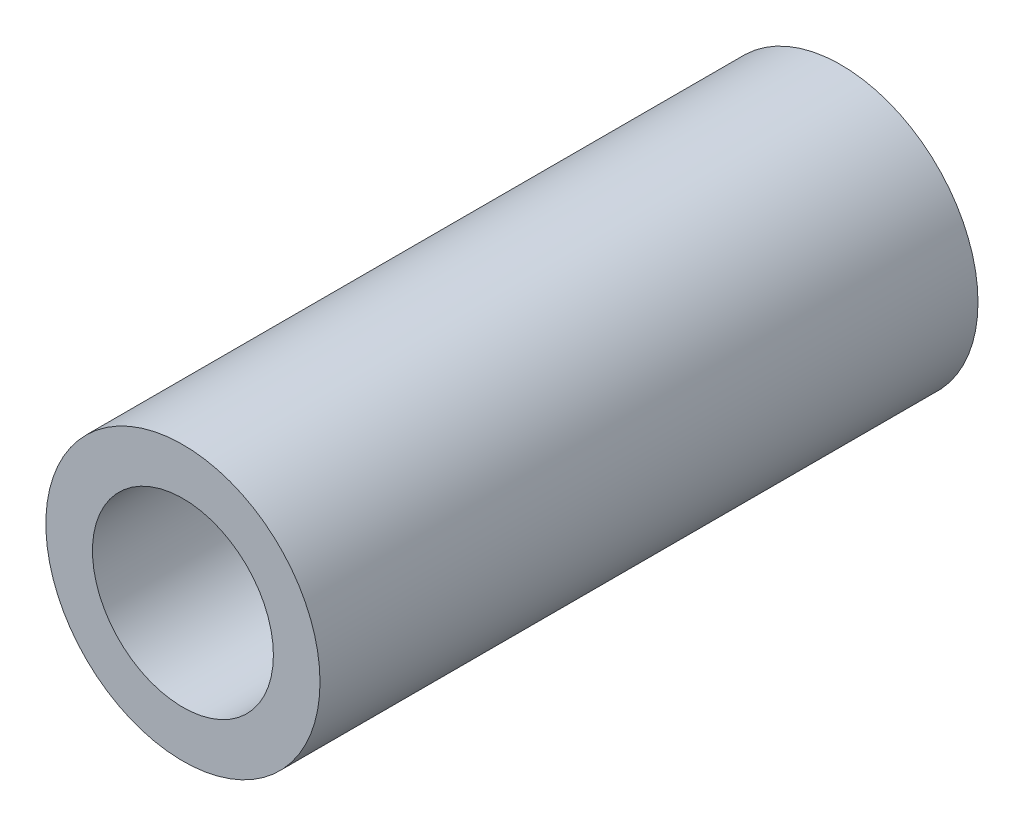
ISO-10303-21;
HEADER;
FILE_DESCRIPTION(('STEP AP214'),'2;1');
FILE_NAME('part.step','',(''),(''),'','','');
FILE_SCHEMA(('AUTOMOTIVE_DESIGN { 1 0 10303 214 1 1 1 1 }'));
ENDSEC;
DATA;
#1=APPLICATION_CONTEXT('core data for automotive mechanical design processes');
#2=APPLICATION_PROTOCOL_DEFINITION('international standard','automotive_design',2000,#1);
#3=PRODUCT_CONTEXT('',#1,'mechanical');
#4=PRODUCT('Part','Part','',(#3));
#5=PRODUCT_RELATED_PRODUCT_CATEGORY('part','',(#4));
#6=PRODUCT_DEFINITION_FORMATION('','',#4);
#7=PRODUCT_DEFINITION_CONTEXT('part definition',#1,'design');
#8=PRODUCT_DEFINITION('design','',#6,#7);
#9=PRODUCT_DEFINITION_SHAPE('','',#8);
#10=(LENGTH_UNIT() NAMED_UNIT(*) SI_UNIT(.MILLI.,.METRE.));
#11=(NAMED_UNIT(*) PLANE_ANGLE_UNIT() SI_UNIT($,.RADIAN.));
#12=(NAMED_UNIT(*) SI_UNIT($,.STERADIAN.) SOLID_ANGLE_UNIT());
#13=UNCERTAINTY_MEASURE_WITH_UNIT(LENGTH_MEASURE(1.E-05),#10,'distance_accuracy_value','');
#14=(GEOMETRIC_REPRESENTATION_CONTEXT(3) GLOBAL_UNCERTAINTY_ASSIGNED_CONTEXT((#13)) GLOBAL_UNIT_ASSIGNED_CONTEXT((#10,
#11,#12)) REPRESENTATION_CONTEXT('',''));
#15=CARTESIAN_POINT('',(0.,0.,0.));
#16=DIRECTION('',(0.,0.,1.));
#17=DIRECTION('',(1.,0.,0.));
#18=AXIS2_PLACEMENT_3D('',#15,#16,#17);
#19=CARTESIAN_POINT('',(0.,0.,12.));
#20=DIRECTION('',(0.,0.,-1.));
#21=DIRECTION('',(-1.,0.,0.));
#22=AXIS2_PLACEMENT_3D('',#19,#20,#21);
#23=CYLINDRICAL_SURFACE('',#22,2.5);
#24=CARTESIAN_POINT('',(0.,0.,12.));
#25=DIRECTION('',(0.,0.,1.));
#26=DIRECTION('',(1.,0.,0.));
#27=AXIS2_PLACEMENT_3D('',#24,#25,#26);
#28=CIRCLE('',#27,2.5);
#29=CARTESIAN_POINT('',(2.5,0.,12.));
#30=VERTEX_POINT('',#29);
#31=EDGE_CURVE('E10',#30,#30,#28,.T.);
#32=ORIENTED_EDGE('',*,*,#31,.F.);
#33=EDGE_LOOP('',(#32));
#34=FACE_BOUND('',#33,.T.);
#35=CARTESIAN_POINT('',(0.,0.,0.));
#36=DIRECTION('',(0.,0.,1.));
#37=DIRECTION('',(1.,0.,0.));
#38=AXIS2_PLACEMENT_3D('',#35,#36,#37);
#39=CIRCLE('',#38,2.5);
#40=CARTESIAN_POINT('',(2.5,0.,0.));
#41=VERTEX_POINT('',#40);
#42=EDGE_CURVE('E36',#41,#41,#39,.T.);
#43=ORIENTED_EDGE('',*,*,#42,.T.);
#44=EDGE_LOOP('',(#43));
#45=FACE_BOUND('',#44,.T.);
#46=ADVANCED_FACE('F33',(#34,#45),#23,.T.);
#47=CARTESIAN_POINT('',(0.,0.,12.));
#48=DIRECTION('',(0.,0.,1.));
#49=DIRECTION('',(1.,0.,0.));
#50=AXIS2_PLACEMENT_3D('',#47,#48,#49);
#51=PLANE('',#50);
#52=CARTESIAN_POINT('',(0.,0.,12.));
#53=DIRECTION('',(0.,0.,1.));
#54=DIRECTION('',(1.,0.,0.));
#55=AXIS2_PLACEMENT_3D('',#52,#53,#54);
#56=CIRCLE('',#55,1.65);
#57=CARTESIAN_POINT('',(1.65,0.,12.));
#58=VERTEX_POINT('',#57);
#59=EDGE_CURVE('E47',#58,#58,#56,.T.);
#60=ORIENTED_EDGE('',*,*,#59,.F.);
#61=EDGE_LOOP('',(#60));
#62=FACE_BOUND('',#61,.T.);
#63=ORIENTED_EDGE('',*,*,#31,.T.);
#64=EDGE_LOOP('',(#63));
#65=FACE_BOUND('',#64,.T.);
#66=ADVANCED_FACE('F53',(#62,#65),#51,.T.);
#67=CARTESIAN_POINT('',(0.,0.,0.));
#68=DIRECTION('',(0.,0.,1.));
#69=DIRECTION('',(1.,0.,0.));
#70=AXIS2_PLACEMENT_3D('',#67,#68,#69);
#71=PLANE('',#70);
#72=CARTESIAN_POINT('',(0.,0.,0.));
#73=DIRECTION('',(0.,0.,1.));
#74=DIRECTION('',(1.,0.,0.));
#75=AXIS2_PLACEMENT_3D('',#72,#73,#74);
#76=CIRCLE('',#75,1.65);
#77=CARTESIAN_POINT('',(1.65,0.,0.));
#78=VERTEX_POINT('',#77);
#79=EDGE_CURVE('E43',#78,#78,#76,.T.);
#80=ORIENTED_EDGE('',*,*,#79,.T.);
#81=EDGE_LOOP('',(#80));
#82=FACE_BOUND('',#81,.T.);
#83=ORIENTED_EDGE('',*,*,#42,.F.);
#84=EDGE_LOOP('',(#83));
#85=FACE_BOUND('',#84,.T.);
#86=ADVANCED_FACE('F55',(#82,#85),#71,.F.);
#87=CARTESIAN_POINT('',(0.,0.,12.));
#88=DIRECTION('',(0.,0.,1.));
#89=DIRECTION('',(1.,0.,0.));
#90=AXIS2_PLACEMENT_3D('',#87,#88,#89);
#91=CYLINDRICAL_SURFACE('',#90,1.65);
#92=ORIENTED_EDGE('',*,*,#79,.F.);
#93=EDGE_LOOP('',(#92));
#94=FACE_BOUND('',#93,.T.);
#95=ORIENTED_EDGE('',*,*,#59,.T.);
#96=EDGE_LOOP('',(#95));
#97=FACE_BOUND('',#96,.T.);
#98=ADVANCED_FACE('F51',(#94,#97),#91,.F.);
#99=CLOSED_SHELL('',(#46,#66,#86,#98));
#100=MANIFOLD_SOLID_BREP('B2',#99);
#101=ADVANCED_BREP_SHAPE_REPRESENTATION('',(#18,#100),#14);
#102=SHAPE_DEFINITION_REPRESENTATION(#9,#101);
ENDSEC;
END-ISO-10303-21;
